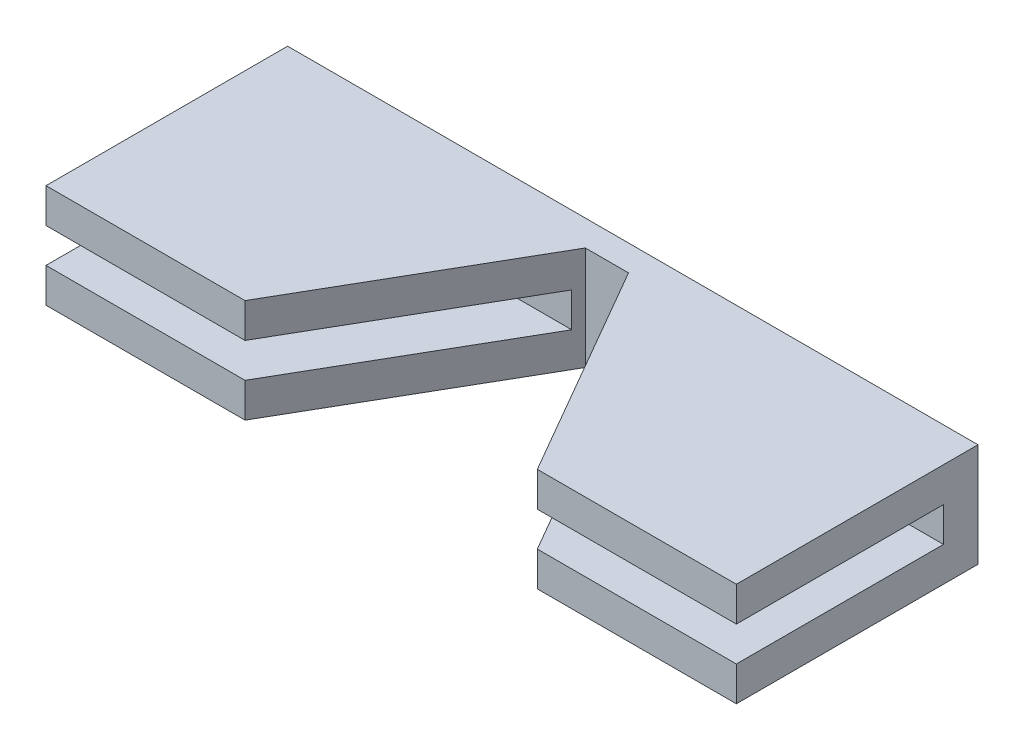
ISO-10303-21;
HEADER;
FILE_DESCRIPTION(('STEP AP214'),'2;1');
FILE_NAME('part.step','',(''),(''),'','','');
FILE_SCHEMA(('AUTOMOTIVE_DESIGN { 1 0 10303 214 1 1 1 1 }'));
ENDSEC;
DATA;
#1=APPLICATION_CONTEXT('core data for automotive mechanical design processes');
#2=APPLICATION_PROTOCOL_DEFINITION('international standard','automotive_design',2000,#1);
#3=PRODUCT_CONTEXT('',#1,'mechanical');
#4=PRODUCT('Part','Part','',(#3));
#5=PRODUCT_RELATED_PRODUCT_CATEGORY('part','',(#4));
#6=PRODUCT_DEFINITION_FORMATION('','',#4);
#7=PRODUCT_DEFINITION_CONTEXT('part definition',#1,'design');
#8=PRODUCT_DEFINITION('design','',#6,#7);
#9=PRODUCT_DEFINITION_SHAPE('','',#8);
#10=(LENGTH_UNIT() NAMED_UNIT(*) SI_UNIT(.MILLI.,.METRE.));
#11=(NAMED_UNIT(*) PLANE_ANGLE_UNIT() SI_UNIT($,.RADIAN.));
#12=(NAMED_UNIT(*) SI_UNIT($,.STERADIAN.) SOLID_ANGLE_UNIT());
#13=UNCERTAINTY_MEASURE_WITH_UNIT(LENGTH_MEASURE(1.E-05),#10,'distance_accuracy_value','');
#14=(GEOMETRIC_REPRESENTATION_CONTEXT(3) GLOBAL_UNCERTAINTY_ASSIGNED_CONTEXT((#13)) GLOBAL_UNIT_ASSIGNED_CONTEXT((#10,
#11,#12)) REPRESENTATION_CONTEXT('',''));
#15=CARTESIAN_POINT('',(0.,0.,0.));
#16=DIRECTION('',(0.,0.,1.));
#17=DIRECTION('',(1.,0.,0.));
#18=AXIS2_PLACEMENT_3D('',#15,#16,#17);
#19=CARTESIAN_POINT('',(0.,6.,0.));
#20=DIRECTION('',(1.,0.,0.));
#21=DIRECTION('',(0.,0.,-1.));
#22=AXIS2_PLACEMENT_3D('',#19,#20,#21);
#23=PLANE('',#22);
#24=DIRECTION('',(0.,0.,1.));
#25=VECTOR('',#24,1.);
#26=CARTESIAN_POINT('',(0.,2.,0.));
#27=LINE('',#26,#25);
#28=CARTESIAN_POINT('',(0.,2.,2.));
#29=VERTEX_POINT('',#28);
#30=CARTESIAN_POINT('',(0.,2.,14.));
#31=VERTEX_POINT('',#30);
#32=EDGE_CURVE('E238',#29,#31,#27,.T.);
#33=ORIENTED_EDGE('',*,*,#32,.F.);
#34=DIRECTION('',(0.,-1.,0.));
#35=VECTOR('',#34,1.);
#36=CARTESIAN_POINT('',(0.,6.,2.));
#37=LINE('',#36,#35);
#38=CARTESIAN_POINT('',(0.,4.,2.));
#39=VERTEX_POINT('',#38);
#40=EDGE_CURVE('E243',#39,#29,#37,.T.);
#41=ORIENTED_EDGE('',*,*,#40,.F.);
#42=DIRECTION('',(0.,0.,1.));
#43=VECTOR('',#42,1.);
#44=CARTESIAN_POINT('',(0.,4.,0.));
#45=LINE('',#44,#43);
#46=CARTESIAN_POINT('',(0.,4.,14.));
#47=VERTEX_POINT('',#46);
#48=EDGE_CURVE('E241',#39,#47,#45,.T.);
#49=ORIENTED_EDGE('',*,*,#48,.T.);
#50=DIRECTION('',(0.,-1.,0.));
#51=VECTOR('',#50,1.);
#52=CARTESIAN_POINT('',(0.,6.,14.));
#53=LINE('',#52,#51);
#54=CARTESIAN_POINT('',(0.,6.,14.));
#55=VERTEX_POINT('',#54);
#56=EDGE_CURVE('E53',#55,#47,#53,.T.);
#57=ORIENTED_EDGE('',*,*,#56,.F.);
#58=DIRECTION('',(0.,0.,1.));
#59=VECTOR('',#58,1.);
#60=CARTESIAN_POINT('',(0.,6.,0.));
#61=LINE('',#60,#59);
#62=CARTESIAN_POINT('',(0.,6.,0.));
#63=VERTEX_POINT('',#62);
#64=EDGE_CURVE('E96',#63,#55,#61,.T.);
#65=ORIENTED_EDGE('',*,*,#64,.F.);
#66=DIRECTION('',(0.,-1.,0.));
#67=VECTOR('',#66,1.);
#68=CARTESIAN_POINT('',(0.,6.,0.));
#69=LINE('',#68,#67);
#70=CARTESIAN_POINT('',(0.,0.,0.));
#71=VERTEX_POINT('',#70);
#72=EDGE_CURVE('E11',#63,#71,#69,.T.);
#73=ORIENTED_EDGE('',*,*,#72,.T.);
#74=DIRECTION('',(0.,0.,1.));
#75=VECTOR('',#74,1.);
#76=CARTESIAN_POINT('',(0.,0.,0.));
#77=LINE('',#76,#75);
#78=CARTESIAN_POINT('',(0.,0.,14.));
#79=VERTEX_POINT('',#78);
#80=EDGE_CURVE('E272',#71,#79,#77,.T.);
#81=ORIENTED_EDGE('',*,*,#80,.T.);
#82=EDGE_CURVE('E284',#31,#79,#53,.T.);
#83=ORIENTED_EDGE('',*,*,#82,.F.);
#84=EDGE_LOOP('',(#33,#41,#49,#57,#65,#73,#81,#83));
#85=FACE_BOUND('',#84,.T.);
#86=ADVANCED_FACE('F45',(#85),#23,.F.);
#87=CARTESIAN_POINT('',(0.,6.,14.));
#88=DIRECTION('',(0.,0.,-1.));
#89=DIRECTION('',(-1.,0.,0.));
#90=AXIS2_PLACEMENT_3D('',#87,#88,#89);
#91=PLANE('',#90);
#92=DIRECTION('',(1.,0.,0.));
#93=VECTOR('',#92,1.);
#94=CARTESIAN_POINT('',(0.,2.,14.));
#95=LINE('',#94,#93);
#96=CARTESIAN_POINT('',(11.5331216351296,2.,14.));
#97=VERTEX_POINT('',#96);
#98=EDGE_CURVE('E247',#31,#97,#95,.T.);
#99=ORIENTED_EDGE('',*,*,#98,.F.);
#100=ORIENTED_EDGE('',*,*,#82,.T.);
#101=DIRECTION('',(1.,0.,0.));
#102=VECTOR('',#101,1.);
#103=CARTESIAN_POINT('',(0.,0.,14.));
#104=LINE('',#103,#102);
#105=CARTESIAN_POINT('',(11.5331216351296,0.,14.));
#106=VERTEX_POINT('',#105);
#107=EDGE_CURVE('E275',#79,#106,#104,.T.);
#108=ORIENTED_EDGE('',*,*,#107,.T.);
#109=DIRECTION('',(0.,-1.,0.));
#110=VECTOR('',#109,1.);
#111=CARTESIAN_POINT('',(11.5331216351296,6.,14.));
#112=LINE('',#111,#110);
#113=EDGE_CURVE('E281',#97,#106,#112,.T.);
#114=ORIENTED_EDGE('',*,*,#113,.F.);
#115=EDGE_LOOP('',(#99,#100,#108,#114));
#116=FACE_BOUND('',#115,.T.);
#117=ADVANCED_FACE('F291',(#116),#91,.F.);
#118=CARTESIAN_POINT('',(11.5331216351296,6.,14.));
#119=DIRECTION('',(-0.866025403784436,0.,-0.500000000000004));
#120=DIRECTION('',(-0.500000000000004,0.,0.866025403784437));
#121=AXIS2_PLACEMENT_3D('',#118,#119,#120);
#122=PLANE('',#121);
#123=DIRECTION('',(0.500000000000004,0.,-0.866025403784437));
#124=VECTOR('',#123,1.);
#125=CARTESIAN_POINT('',(11.5331216351296,2.,14.));
#126=LINE('',#125,#124);
#127=CARTESIAN_POINT('',(18.4613248654052,2.,2.));
#128=VERTEX_POINT('',#127);
#129=EDGE_CURVE('E242',#97,#128,#126,.T.);
#130=ORIENTED_EDGE('',*,*,#129,.F.);
#131=ORIENTED_EDGE('',*,*,#113,.T.);
#132=DIRECTION('',(0.500000000000004,0.,-0.866025403784436));
#133=VECTOR('',#132,1.);
#134=CARTESIAN_POINT('',(11.5331216351296,0.,14.));
#135=LINE('',#134,#133);
#136=CARTESIAN_POINT('',(18.75,0.,1.5));
#137=VERTEX_POINT('',#136);
#138=EDGE_CURVE('E89',#106,#137,#135,.T.);
#139=ORIENTED_EDGE('',*,*,#138,.T.);
#140=DIRECTION('',(0.,-1.,0.));
#141=VECTOR('',#140,1.);
#142=CARTESIAN_POINT('',(18.75,6.,1.5));
#143=LINE('',#142,#141);
#144=CARTESIAN_POINT('',(18.75,6.,1.5));
#145=VERTEX_POINT('',#144);
#146=EDGE_CURVE('E269',#145,#137,#143,.T.);
#147=ORIENTED_EDGE('',*,*,#146,.F.);
#148=DIRECTION('',(0.500000000000004,0.,-0.866025403784436));
#149=VECTOR('',#148,1.);
#150=CARTESIAN_POINT('',(11.5331216351296,6.,14.));
#151=LINE('',#150,#149);
#152=CARTESIAN_POINT('',(11.5331216351296,6.,14.));
#153=VERTEX_POINT('',#152);
#154=EDGE_CURVE('E69',#153,#145,#151,.T.);
#155=ORIENTED_EDGE('',*,*,#154,.F.);
#156=CARTESIAN_POINT('',(11.5331216351296,4.,14.));
#157=VERTEX_POINT('',#156);
#158=EDGE_CURVE('E282',#153,#157,#112,.T.);
#159=ORIENTED_EDGE('',*,*,#158,.T.);
#160=DIRECTION('',(0.500000000000004,0.,-0.866025403784437));
#161=VECTOR('',#160,1.);
#162=CARTESIAN_POINT('',(11.5331216351296,4.,14.));
#163=LINE('',#162,#161);
#164=CARTESIAN_POINT('',(18.4613248654052,4.,2.));
#165=VERTEX_POINT('',#164);
#166=EDGE_CURVE('E245',#157,#165,#163,.T.);
#167=ORIENTED_EDGE('',*,*,#166,.T.);
#168=DIRECTION('',(0.,-1.,0.));
#169=VECTOR('',#168,1.);
#170=CARTESIAN_POINT('',(18.4613248654052,6.,2.));
#171=LINE('',#170,#169);
#172=EDGE_CURVE('E60',#128,#165,#171,.F.);
#173=ORIENTED_EDGE('',*,*,#172,.F.);
#174=EDGE_LOOP('',(#130,#131,#139,#147,#155,#159,#167,#173));
#175=FACE_BOUND('',#174,.T.);
#176=ADVANCED_FACE('F304',(#175),#122,.F.);
#177=CARTESIAN_POINT('',(20.,6.,0.));
#178=DIRECTION('',(0.,0.,1.));
#179=DIRECTION('',(1.,0.,0.));
#180=AXIS2_PLACEMENT_3D('',#177,#178,#179);
#181=PLANE('',#180);
#182=DIRECTION('',(-1.,0.,0.));
#183=VECTOR('',#182,1.);
#184=CARTESIAN_POINT('',(20.,0.,0.));
#185=LINE('',#184,#183);
#186=CARTESIAN_POINT('',(40.,0.,0.));
#187=VERTEX_POINT('',#186);
#188=EDGE_CURVE('E259',#187,#71,#185,.T.);
#189=ORIENTED_EDGE('',*,*,#188,.T.);
#190=ORIENTED_EDGE('',*,*,#72,.F.);
#191=DIRECTION('',(-1.,0.,0.));
#192=VECTOR('',#191,1.);
#193=CARTESIAN_POINT('',(20.,6.,0.));
#194=LINE('',#193,#192);
#195=CARTESIAN_POINT('',(40.,6.,0.));
#196=VERTEX_POINT('',#195);
#197=EDGE_CURVE('E260',#196,#63,#194,.T.);
#198=ORIENTED_EDGE('',*,*,#197,.F.);
#199=DIRECTION('',(0.,-1.,0.));
#200=VECTOR('',#199,1.);
#201=CARTESIAN_POINT('',(40.,6.,0.));
#202=LINE('',#201,#200);
#203=EDGE_CURVE('E232',#196,#187,#202,.T.);
#204=ORIENTED_EDGE('',*,*,#203,.T.);
#205=EDGE_LOOP('',(#189,#190,#198,#204));
#206=FACE_BOUND('',#205,.T.);
#207=ADVANCED_FACE('F47',(#206),#181,.F.);
#208=ORIENTED_EDGE('',*,*,#56,.T.);
#209=DIRECTION('',(1.,0.,0.));
#210=VECTOR('',#209,1.);
#211=CARTESIAN_POINT('',(0.,4.,14.));
#212=LINE('',#211,#210);
#213=EDGE_CURVE('E253',#47,#157,#212,.T.);
#214=ORIENTED_EDGE('',*,*,#213,.T.);
#215=ORIENTED_EDGE('',*,*,#158,.F.);
#216=DIRECTION('',(1.,0.,0.));
#217=VECTOR('',#216,1.);
#218=CARTESIAN_POINT('',(0.,6.,14.));
#219=LINE('',#218,#217);
#220=EDGE_CURVE('E264',#55,#153,#219,.T.);
#221=ORIENTED_EDGE('',*,*,#220,.F.);
#222=EDGE_LOOP('',(#208,#214,#215,#221));
#223=FACE_BOUND('',#222,.T.);
#224=ADVANCED_FACE('F306',(#223),#91,.F.);
#225=CARTESIAN_POINT('',(18.75,6.,1.5));
#226=DIRECTION('',(0.,0.,-1.));
#227=DIRECTION('',(-1.,0.,0.));
#228=AXIS2_PLACEMENT_3D('',#225,#226,#227);
#229=PLANE('',#228);
#230=DIRECTION('',(1.,0.,0.));
#231=VECTOR('',#230,1.);
#232=CARTESIAN_POINT('',(18.75,0.,1.5));
#233=LINE('',#232,#231);
#234=CARTESIAN_POINT('',(21.25,0.,1.5));
#235=VERTEX_POINT('',#234);
#236=EDGE_CURVE('E262',#137,#235,#233,.T.);
#237=ORIENTED_EDGE('',*,*,#236,.T.);
#238=DIRECTION('',(0.,-1.,0.));
#239=VECTOR('',#238,1.);
#240=CARTESIAN_POINT('',(21.25,6.,1.5));
#241=LINE('',#240,#239);
#242=CARTESIAN_POINT('',(21.25,6.,1.5));
#243=VERTEX_POINT('',#242);
#244=EDGE_CURVE('E215',#243,#235,#241,.T.);
#245=ORIENTED_EDGE('',*,*,#244,.F.);
#246=DIRECTION('',(1.,0.,0.));
#247=VECTOR('',#246,1.);
#248=CARTESIAN_POINT('',(18.75,6.,1.5));
#249=LINE('',#248,#247);
#250=EDGE_CURVE('E267',#145,#243,#249,.T.);
#251=ORIENTED_EDGE('',*,*,#250,.F.);
#252=ORIENTED_EDGE('',*,*,#146,.T.);
#253=EDGE_LOOP('',(#237,#245,#251,#252));
#254=FACE_BOUND('',#253,.T.);
#255=ADVANCED_FACE('F301',(#254),#229,.F.);
#256=CARTESIAN_POINT('',(0.,6.,0.));
#257=DIRECTION('',(0.,1.,0.));
#258=DIRECTION('',(0.,0.,1.));
#259=AXIS2_PLACEMENT_3D('',#256,#257,#258);
#260=PLANE('',#259);
#261=ORIENTED_EDGE('',*,*,#197,.T.);
#262=ORIENTED_EDGE('',*,*,#64,.T.);
#263=ORIENTED_EDGE('',*,*,#220,.T.);
#264=ORIENTED_EDGE('',*,*,#154,.T.);
#265=ORIENTED_EDGE('',*,*,#250,.T.);
#266=DIRECTION('',(-0.500000000000004,0.,-0.866025403784436));
#267=VECTOR('',#266,1.);
#268=CARTESIAN_POINT('',(28.4668783648704,6.,14.));
#269=LINE('',#268,#267);
#270=CARTESIAN_POINT('',(28.4668783648704,6.,14.));
#271=VERTEX_POINT('',#270);
#272=EDGE_CURVE('E212',#271,#243,#269,.T.);
#273=ORIENTED_EDGE('',*,*,#272,.F.);
#274=DIRECTION('',(-1.,0.,0.));
#275=VECTOR('',#274,1.);
#276=CARTESIAN_POINT('',(40.,6.,14.));
#277=LINE('',#276,#275);
#278=CARTESIAN_POINT('',(40.,6.,14.));
#279=VERTEX_POINT('',#278);
#280=EDGE_CURVE('E209',#279,#271,#277,.T.);
#281=ORIENTED_EDGE('',*,*,#280,.F.);
#282=DIRECTION('',(0.,0.,1.));
#283=VECTOR('',#282,1.);
#284=CARTESIAN_POINT('',(40.,6.,0.));
#285=LINE('',#284,#283);
#286=EDGE_CURVE('E206',#196,#279,#285,.T.);
#287=ORIENTED_EDGE('',*,*,#286,.F.);
#288=EDGE_LOOP('',(#261,#262,#263,#264,#265,#273,#281,#287));
#289=FACE_BOUND('',#288,.T.);
#290=ADVANCED_FACE('F337',(#289),#260,.T.);
#291=CARTESIAN_POINT('',(0.,0.,0.));
#292=DIRECTION('',(0.,1.,0.));
#293=DIRECTION('',(0.,0.,1.));
#294=AXIS2_PLACEMENT_3D('',#291,#292,#293);
#295=PLANE('',#294);
#296=ORIENTED_EDGE('',*,*,#188,.F.);
#297=DIRECTION('',(0.,0.,1.));
#298=VECTOR('',#297,1.);
#299=CARTESIAN_POINT('',(40.,0.,0.));
#300=LINE('',#299,#298);
#301=CARTESIAN_POINT('',(40.,0.,14.));
#302=VERTEX_POINT('',#301);
#303=EDGE_CURVE('E205',#187,#302,#300,.T.);
#304=ORIENTED_EDGE('',*,*,#303,.T.);
#305=DIRECTION('',(-1.,0.,0.));
#306=VECTOR('',#305,1.);
#307=CARTESIAN_POINT('',(40.,0.,14.));
#308=LINE('',#307,#306);
#309=CARTESIAN_POINT('',(28.4668783648704,0.,14.));
#310=VERTEX_POINT('',#309);
#311=EDGE_CURVE('E218',#302,#310,#308,.T.);
#312=ORIENTED_EDGE('',*,*,#311,.T.);
#313=DIRECTION('',(-0.500000000000004,0.,-0.866025403784436));
#314=VECTOR('',#313,1.);
#315=CARTESIAN_POINT('',(28.4668783648704,0.,14.));
#316=LINE('',#315,#314);
#317=EDGE_CURVE('E210',#310,#235,#316,.T.);
#318=ORIENTED_EDGE('',*,*,#317,.T.);
#319=ORIENTED_EDGE('',*,*,#236,.F.);
#320=ORIENTED_EDGE('',*,*,#138,.F.);
#321=ORIENTED_EDGE('',*,*,#107,.F.);
#322=ORIENTED_EDGE('',*,*,#80,.F.);
#323=EDGE_LOOP('',(#296,#304,#312,#318,#319,#320,#321,#322));
#324=FACE_BOUND('',#323,.T.);
#325=ADVANCED_FACE('F297',(#324),#295,.F.);
#326=CARTESIAN_POINT('',(20.,6.,2.));
#327=DIRECTION('',(0.,0.,1.));
#328=DIRECTION('',(1.,0.,0.));
#329=AXIS2_PLACEMENT_3D('',#326,#327,#328);
#330=PLANE('',#329);
#331=DIRECTION('',(-1.,0.,0.));
#332=VECTOR('',#331,1.);
#333=CARTESIAN_POINT('',(20.,2.,2.));
#334=LINE('',#333,#332);
#335=EDGE_CURVE('E235',#128,#29,#334,.T.);
#336=ORIENTED_EDGE('',*,*,#335,.F.);
#337=ORIENTED_EDGE('',*,*,#172,.T.);
#338=DIRECTION('',(-1.,0.,0.));
#339=VECTOR('',#338,1.);
#340=CARTESIAN_POINT('',(20.,4.,2.));
#341=LINE('',#340,#339);
#342=EDGE_CURVE('E239',#165,#39,#341,.T.);
#343=ORIENTED_EDGE('',*,*,#342,.T.);
#344=ORIENTED_EDGE('',*,*,#40,.T.);
#345=EDGE_LOOP('',(#336,#337,#343,#344));
#346=FACE_BOUND('',#345,.T.);
#347=ADVANCED_FACE('F310',(#346),#330,.T.);
#348=CARTESIAN_POINT('',(0.,4.,0.));
#349=DIRECTION('',(0.,1.,0.));
#350=DIRECTION('',(0.,0.,1.));
#351=AXIS2_PLACEMENT_3D('',#348,#349,#350);
#352=PLANE('',#351);
#353=ORIENTED_EDGE('',*,*,#342,.F.);
#354=ORIENTED_EDGE('',*,*,#166,.F.);
#355=ORIENTED_EDGE('',*,*,#213,.F.);
#356=ORIENTED_EDGE('',*,*,#48,.F.);
#357=EDGE_LOOP('',(#353,#354,#355,#356));
#358=FACE_BOUND('',#357,.T.);
#359=ADVANCED_FACE('F308',(#358),#352,.F.);
#360=CARTESIAN_POINT('',(0.,2.,0.));
#361=DIRECTION('',(0.,1.,0.));
#362=DIRECTION('',(0.,0.,1.));
#363=AXIS2_PLACEMENT_3D('',#360,#361,#362);
#364=PLANE('',#363);
#365=ORIENTED_EDGE('',*,*,#335,.T.);
#366=ORIENTED_EDGE('',*,*,#32,.T.);
#367=ORIENTED_EDGE('',*,*,#98,.T.);
#368=ORIENTED_EDGE('',*,*,#129,.T.);
#369=EDGE_LOOP('',(#365,#366,#367,#368));
#370=FACE_BOUND('',#369,.T.);
#371=ADVANCED_FACE('F312',(#370),#364,.T.);
#372=CARTESIAN_POINT('',(40.,6.,0.));
#373=DIRECTION('',(-1.,0.,0.));
#374=DIRECTION('',(0.,0.,-1.));
#375=AXIS2_PLACEMENT_3D('',#372,#373,#374);
#376=PLANE('',#375);
#377=DIRECTION('',(0.,0.,1.));
#378=VECTOR('',#377,1.);
#379=CARTESIAN_POINT('',(40.,2.,0.));
#380=LINE('',#379,#378);
#381=CARTESIAN_POINT('',(40.,2.,2.));
#382=VERTEX_POINT('',#381);
#383=CARTESIAN_POINT('',(40.,2.,14.));
#384=VERTEX_POINT('',#383);
#385=EDGE_CURVE('E177',#382,#384,#380,.T.);
#386=ORIENTED_EDGE('',*,*,#385,.T.);
#387=DIRECTION('',(0.,-1.,0.));
#388=VECTOR('',#387,1.);
#389=CARTESIAN_POINT('',(40.,6.,14.));
#390=LINE('',#389,#388);
#391=EDGE_CURVE('E229',#384,#302,#390,.T.);
#392=ORIENTED_EDGE('',*,*,#391,.T.);
#393=ORIENTED_EDGE('',*,*,#303,.F.);
#394=ORIENTED_EDGE('',*,*,#203,.F.);
#395=ORIENTED_EDGE('',*,*,#286,.T.);
#396=CARTESIAN_POINT('',(40.,4.,14.));
#397=VERTEX_POINT('',#396);
#398=EDGE_CURVE('E230',#279,#397,#390,.T.);
#399=ORIENTED_EDGE('',*,*,#398,.T.);
#400=DIRECTION('',(0.,0.,1.));
#401=VECTOR('',#400,1.);
#402=CARTESIAN_POINT('',(40.,4.,0.));
#403=LINE('',#402,#401);
#404=CARTESIAN_POINT('',(40.,4.,2.));
#405=VERTEX_POINT('',#404);
#406=EDGE_CURVE('E185',#405,#397,#403,.T.);
#407=ORIENTED_EDGE('',*,*,#406,.F.);
#408=DIRECTION('',(0.,-1.,0.));
#409=VECTOR('',#408,1.);
#410=CARTESIAN_POINT('',(40.,6.,2.));
#411=LINE('',#410,#409);
#412=EDGE_CURVE('E170',#405,#382,#411,.T.);
#413=ORIENTED_EDGE('',*,*,#412,.T.);
#414=EDGE_LOOP('',(#386,#392,#393,#394,#395,#399,#407,#413));
#415=FACE_BOUND('',#414,.T.);
#416=ADVANCED_FACE('F181',(#415),#376,.F.);
#417=CARTESIAN_POINT('',(40.,6.,14.));
#418=DIRECTION('',(0.,0.,-1.));
#419=DIRECTION('',(1.,0.,0.));
#420=AXIS2_PLACEMENT_3D('',#417,#418,#419);
#421=PLANE('',#420);
#422=DIRECTION('',(-1.,0.,0.));
#423=VECTOR('',#422,1.);
#424=CARTESIAN_POINT('',(40.,2.,14.));
#425=LINE('',#424,#423);
#426=CARTESIAN_POINT('',(28.4668783648704,2.,14.));
#427=VERTEX_POINT('',#426);
#428=EDGE_CURVE('E190',#384,#427,#425,.T.);
#429=ORIENTED_EDGE('',*,*,#428,.T.);
#430=DIRECTION('',(0.,-1.,0.));
#431=VECTOR('',#430,1.);
#432=CARTESIAN_POINT('',(28.4668783648704,6.,14.));
#433=LINE('',#432,#431);
#434=EDGE_CURVE('E225',#427,#310,#433,.T.);
#435=ORIENTED_EDGE('',*,*,#434,.T.);
#436=ORIENTED_EDGE('',*,*,#311,.F.);
#437=ORIENTED_EDGE('',*,*,#391,.F.);
#438=EDGE_LOOP('',(#429,#435,#436,#437));
#439=FACE_BOUND('',#438,.T.);
#440=ADVANCED_FACE('F320',(#439),#421,.F.);
#441=CARTESIAN_POINT('',(28.4668783648704,6.,14.));
#442=DIRECTION('',(0.866025403784436,0.,-0.500000000000004));
#443=DIRECTION('',(0.500000000000004,0.,0.866025403784437));
#444=AXIS2_PLACEMENT_3D('',#441,#442,#443);
#445=PLANE('',#444);
#446=DIRECTION('',(-0.500000000000004,0.,-0.866025403784437));
#447=VECTOR('',#446,1.);
#448=CARTESIAN_POINT('',(28.4668783648704,2.,14.));
#449=LINE('',#448,#447);
#450=CARTESIAN_POINT('',(21.5386751345948,2.,2.));
#451=VERTEX_POINT('',#450);
#452=EDGE_CURVE('E193',#427,#451,#449,.T.);
#453=ORIENTED_EDGE('',*,*,#452,.T.);
#454=DIRECTION('',(0.,-1.,0.));
#455=VECTOR('',#454,1.);
#456=CARTESIAN_POINT('',(21.5386751345948,6.,2.));
#457=LINE('',#456,#455);
#458=CARTESIAN_POINT('',(21.5386751345948,4.,2.));
#459=VERTEX_POINT('',#458);
#460=EDGE_CURVE('E173',#451,#459,#457,.F.);
#461=ORIENTED_EDGE('',*,*,#460,.T.);
#462=DIRECTION('',(-0.500000000000004,0.,-0.866025403784437));
#463=VECTOR('',#462,1.);
#464=CARTESIAN_POINT('',(28.4668783648704,4.,14.));
#465=LINE('',#464,#463);
#466=CARTESIAN_POINT('',(28.4668783648704,4.,14.));
#467=VERTEX_POINT('',#466);
#468=EDGE_CURVE('E186',#467,#459,#465,.T.);
#469=ORIENTED_EDGE('',*,*,#468,.F.);
#470=EDGE_CURVE('E226',#271,#467,#433,.T.);
#471=ORIENTED_EDGE('',*,*,#470,.F.);
#472=ORIENTED_EDGE('',*,*,#272,.T.);
#473=ORIENTED_EDGE('',*,*,#244,.T.);
#474=ORIENTED_EDGE('',*,*,#317,.F.);
#475=ORIENTED_EDGE('',*,*,#434,.F.);
#476=EDGE_LOOP('',(#453,#461,#469,#471,#472,#473,#474,#475));
#477=FACE_BOUND('',#476,.T.);
#478=ADVANCED_FACE('F350',(#477),#445,.F.);
#479=ORIENTED_EDGE('',*,*,#398,.F.);
#480=ORIENTED_EDGE('',*,*,#280,.T.);
#481=ORIENTED_EDGE('',*,*,#470,.T.);
#482=DIRECTION('',(-1.,0.,0.));
#483=VECTOR('',#482,1.);
#484=CARTESIAN_POINT('',(40.,4.,14.));
#485=LINE('',#484,#483);
#486=EDGE_CURVE('E201',#397,#467,#485,.T.);
#487=ORIENTED_EDGE('',*,*,#486,.F.);
#488=EDGE_LOOP('',(#479,#480,#481,#487));
#489=FACE_BOUND('',#488,.T.);
#490=ADVANCED_FACE('F356',(#489),#421,.F.);
#491=CARTESIAN_POINT('',(20.,6.,2.));
#492=DIRECTION('',(0.,0.,1.));
#493=DIRECTION('',(-1.,0.,0.));
#494=AXIS2_PLACEMENT_3D('',#491,#492,#493);
#495=PLANE('',#494);
#496=DIRECTION('',(1.,0.,0.));
#497=VECTOR('',#496,1.);
#498=CARTESIAN_POINT('',(20.,2.,2.));
#499=LINE('',#498,#497);
#500=EDGE_CURVE('E167',#451,#382,#499,.T.);
#501=ORIENTED_EDGE('',*,*,#500,.T.);
#502=ORIENTED_EDGE('',*,*,#412,.F.);
#503=DIRECTION('',(1.,0.,0.));
#504=VECTOR('',#503,1.);
#505=CARTESIAN_POINT('',(20.,4.,2.));
#506=LINE('',#505,#504);
#507=EDGE_CURVE('E198',#459,#405,#506,.T.);
#508=ORIENTED_EDGE('',*,*,#507,.F.);
#509=ORIENTED_EDGE('',*,*,#460,.F.);
#510=EDGE_LOOP('',(#501,#502,#508,#509));
#511=FACE_BOUND('',#510,.T.);
#512=ADVANCED_FACE('F169',(#511),#495,.T.);
#513=CARTESIAN_POINT('',(40.,4.,0.));
#514=DIRECTION('',(0.,1.,0.));
#515=DIRECTION('',(0.,0.,1.));
#516=AXIS2_PLACEMENT_3D('',#513,#514,#515);
#517=PLANE('',#516);
#518=ORIENTED_EDGE('',*,*,#507,.T.);
#519=ORIENTED_EDGE('',*,*,#406,.T.);
#520=ORIENTED_EDGE('',*,*,#486,.T.);
#521=ORIENTED_EDGE('',*,*,#468,.T.);
#522=EDGE_LOOP('',(#518,#519,#520,#521));
#523=FACE_BOUND('',#522,.T.);
#524=ADVANCED_FACE('F358',(#523),#517,.F.);
#525=CARTESIAN_POINT('',(40.,2.,0.));
#526=DIRECTION('',(0.,1.,0.));
#527=DIRECTION('',(0.,0.,1.));
#528=AXIS2_PLACEMENT_3D('',#525,#526,#527);
#529=PLANE('',#528);
#530=ORIENTED_EDGE('',*,*,#500,.F.);
#531=ORIENTED_EDGE('',*,*,#452,.F.);
#532=ORIENTED_EDGE('',*,*,#428,.F.);
#533=ORIENTED_EDGE('',*,*,#385,.F.);
#534=EDGE_LOOP('',(#530,#531,#532,#533));
#535=FACE_BOUND('',#534,.T.);
#536=ADVANCED_FACE('F188',(#535),#529,.T.);
#537=CLOSED_SHELL('',(#86,#117,#176,#207,#224,#255,#290,#325,#347,#359,#371,#416,#440,#478,#490,
#512,#524,#536));
#538=MANIFOLD_SOLID_BREP('B2',#537);
#539=ADVANCED_BREP_SHAPE_REPRESENTATION('',(#18,#538),#14);
#540=SHAPE_DEFINITION_REPRESENTATION(#9,#539);
ENDSEC;
END-ISO-10303-21;
